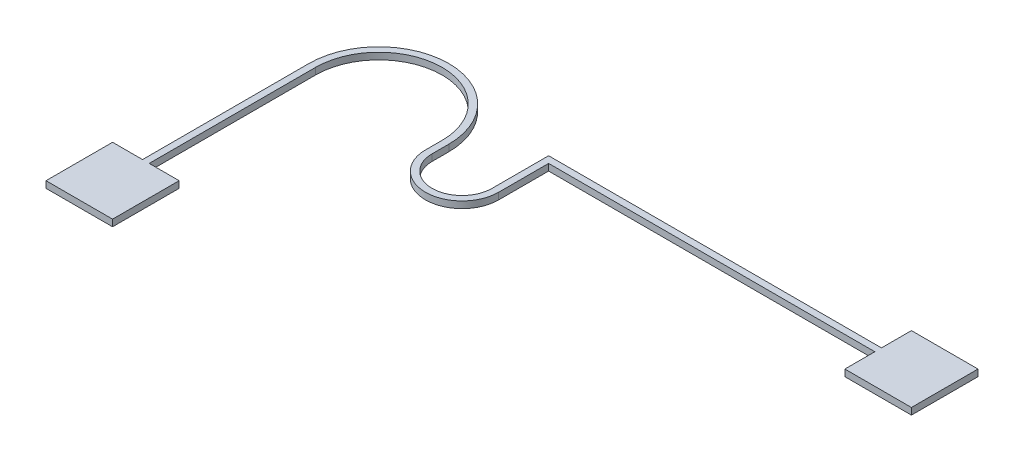
ISO-10303-21;
HEADER;
FILE_DESCRIPTION(('STEP AP214'),'2;1');
FILE_NAME('part.step','',(''),(''),'','','');
FILE_SCHEMA(('AUTOMOTIVE_DESIGN { 1 0 10303 214 1 1 1 1 }'));
ENDSEC;
DATA;
#1=APPLICATION_CONTEXT('core data for automotive mechanical design processes');
#2=APPLICATION_PROTOCOL_DEFINITION('international standard','automotive_design',2000,#1);
#3=PRODUCT_CONTEXT('',#1,'mechanical');
#4=PRODUCT('Part','Part','',(#3));
#5=PRODUCT_RELATED_PRODUCT_CATEGORY('part','',(#4));
#6=PRODUCT_DEFINITION_FORMATION('','',#4);
#7=PRODUCT_DEFINITION_CONTEXT('part definition',#1,'design');
#8=PRODUCT_DEFINITION('design','',#6,#7);
#9=PRODUCT_DEFINITION_SHAPE('','',#8);
#10=(LENGTH_UNIT() NAMED_UNIT(*) SI_UNIT(.MILLI.,.METRE.));
#11=(NAMED_UNIT(*) PLANE_ANGLE_UNIT() SI_UNIT($,.RADIAN.));
#12=(NAMED_UNIT(*) SI_UNIT($,.STERADIAN.) SOLID_ANGLE_UNIT());
#13=UNCERTAINTY_MEASURE_WITH_UNIT(LENGTH_MEASURE(1.E-05),#10,'distance_accuracy_value','');
#14=(GEOMETRIC_REPRESENTATION_CONTEXT(3) GLOBAL_UNCERTAINTY_ASSIGNED_CONTEXT((#13)) GLOBAL_UNIT_ASSIGNED_CONTEXT((#10,
#11,#12)) REPRESENTATION_CONTEXT('',''));
#15=CARTESIAN_POINT('',(0.,0.,0.));
#16=DIRECTION('',(0.,0.,1.));
#17=DIRECTION('',(1.,0.,0.));
#18=AXIS2_PLACEMENT_3D('',#15,#16,#17);
#19=CARTESIAN_POINT('',(100.,20.,0.));
#20=DIRECTION('',(1.,0.,0.));
#21=DIRECTION('',(0.,0.,-1.));
#22=AXIS2_PLACEMENT_3D('',#19,#20,#21);
#23=PLANE('',#22);
#24=DIRECTION('',(0.,0.,1.));
#25=VECTOR('',#24,1.);
#26=CARTESIAN_POINT('',(100.,0.,0.));
#27=LINE('',#26,#25);
#28=CARTESIAN_POINT('',(100.,0.,-100.));
#29=VERTEX_POINT('',#28);
#30=CARTESIAN_POINT('',(100.,0.,100.));
#31=VERTEX_POINT('',#30);
#32=EDGE_CURVE('E311',#29,#31,#27,.T.);
#33=ORIENTED_EDGE('',*,*,#32,.F.);
#34=DIRECTION('',(0.,-1.,0.));
#35=VECTOR('',#34,1.);
#36=CARTESIAN_POINT('',(100.,20.,-100.));
#37=LINE('',#36,#35);
#38=CARTESIAN_POINT('',(100.,20.,-100.));
#39=VERTEX_POINT('',#38);
#40=EDGE_CURVE('E11',#39,#29,#37,.T.);
#41=ORIENTED_EDGE('',*,*,#40,.F.);
#42=DIRECTION('',(0.,0.,1.));
#43=VECTOR('',#42,1.);
#44=CARTESIAN_POINT('',(100.,20.,0.));
#45=LINE('',#44,#43);
#46=CARTESIAN_POINT('',(100.,20.,100.));
#47=VERTEX_POINT('',#46);
#48=EDGE_CURVE('E225',#39,#47,#45,.T.);
#49=ORIENTED_EDGE('',*,*,#48,.T.);
#50=DIRECTION('',(0.,-1.,0.));
#51=VECTOR('',#50,1.);
#52=CARTESIAN_POINT('',(100.,20.,100.));
#53=LINE('',#52,#51);
#54=EDGE_CURVE('E132',#47,#31,#53,.T.);
#55=ORIENTED_EDGE('',*,*,#54,.T.);
#56=EDGE_LOOP('',(#33,#41,#49,#55));
#57=FACE_BOUND('',#56,.T.);
#58=ADVANCED_FACE('F39',(#57),#23,.T.);
#59=CARTESIAN_POINT('',(0.,20.,-100.));
#60=DIRECTION('',(0.,0.,-1.));
#61=DIRECTION('',(-1.,0.,0.));
#62=AXIS2_PLACEMENT_3D('',#59,#60,#61);
#63=PLANE('',#62);
#64=DIRECTION('',(1.,0.,0.));
#65=VECTOR('',#64,1.);
#66=CARTESIAN_POINT('',(0.,0.,-100.));
#67=LINE('',#66,#65);
#68=CARTESIAN_POINT('',(10.,0.,-100.));
#69=VERTEX_POINT('',#68);
#70=EDGE_CURVE('E307',#69,#29,#67,.T.);
#71=ORIENTED_EDGE('',*,*,#70,.F.);
#72=DIRECTION('',(0.,-1.,0.));
#73=VECTOR('',#72,1.);
#74=CARTESIAN_POINT('',(10.,20.,-100.));
#75=LINE('',#74,#73);
#76=CARTESIAN_POINT('',(10.,20.,-100.));
#77=VERTEX_POINT('',#76);
#78=EDGE_CURVE('E48',#77,#69,#75,.T.);
#79=ORIENTED_EDGE('',*,*,#78,.F.);
#80=DIRECTION('',(1.,0.,0.));
#81=VECTOR('',#80,1.);
#82=CARTESIAN_POINT('',(0.,20.,-100.));
#83=LINE('',#82,#81);
#84=EDGE_CURVE('E216',#77,#39,#83,.T.);
#85=ORIENTED_EDGE('',*,*,#84,.T.);
#86=ORIENTED_EDGE('',*,*,#40,.T.);
#87=EDGE_LOOP('',(#71,#79,#85,#86));
#88=FACE_BOUND('',#87,.T.);
#89=ADVANCED_FACE('F308',(#88),#63,.T.);
#90=CARTESIAN_POINT('',(10.,20.,0.));
#91=DIRECTION('',(1.,0.,0.));
#92=DIRECTION('',(0.,0.,-1.));
#93=AXIS2_PLACEMENT_3D('',#90,#91,#92);
#94=PLANE('',#93);
#95=DIRECTION('',(0.,0.,1.));
#96=VECTOR('',#95,1.);
#97=CARTESIAN_POINT('',(10.,0.,0.));
#98=LINE('',#97,#96);
#99=CARTESIAN_POINT('',(10.,0.,-600.));
#100=VERTEX_POINT('',#99);
#101=EDGE_CURVE('E304',#100,#69,#98,.T.);
#102=ORIENTED_EDGE('',*,*,#101,.F.);
#103=DIRECTION('',(0.,-1.,0.));
#104=VECTOR('',#103,1.);
#105=CARTESIAN_POINT('',(10.,20.,-600.));
#106=LINE('',#105,#104);
#107=CARTESIAN_POINT('',(10.,20.,-600.));
#108=VERTEX_POINT('',#107);
#109=EDGE_CURVE('E296',#108,#100,#106,.T.);
#110=ORIENTED_EDGE('',*,*,#109,.F.);
#111=DIRECTION('',(0.,0.,1.));
#112=VECTOR('',#111,1.);
#113=CARTESIAN_POINT('',(10.,20.,0.));
#114=LINE('',#113,#112);
#115=EDGE_CURVE('E224',#108,#77,#114,.T.);
#116=ORIENTED_EDGE('',*,*,#115,.T.);
#117=ORIENTED_EDGE('',*,*,#78,.T.);
#118=EDGE_LOOP('',(#102,#110,#116,#117));
#119=FACE_BOUND('',#118,.T.);
#120=ADVANCED_FACE('F302',(#119),#94,.T.);
#121=CARTESIAN_POINT('',(200.,20.,-600.));
#122=DIRECTION('',(0.,-1.,0.));
#123=DIRECTION('',(0.,0.,-1.));
#124=AXIS2_PLACEMENT_3D('',#121,#122,#123);
#125=CYLINDRICAL_SURFACE('',#124,190.);
#126=CARTESIAN_POINT('',(200.,0.,-600.));
#127=DIRECTION('',(0.,1.,0.));
#128=DIRECTION('',(0.,0.,1.));
#129=AXIS2_PLACEMENT_3D('',#126,#127,#128);
#130=CIRCLE('',#129,190.);
#131=CARTESIAN_POINT('',(390.,0.,-600.));
#132=VERTEX_POINT('',#131);
#133=EDGE_CURVE('E317',#100,#132,#130,.F.);
#134=ORIENTED_EDGE('',*,*,#133,.T.);
#135=DIRECTION('',(0.,-1.,0.));
#136=VECTOR('',#135,1.);
#137=CARTESIAN_POINT('',(390.,20.,-600.));
#138=LINE('',#137,#136);
#139=CARTESIAN_POINT('',(390.,20.,-600.));
#140=VERTEX_POINT('',#139);
#141=EDGE_CURVE('E293',#140,#132,#138,.T.);
#142=ORIENTED_EDGE('',*,*,#141,.F.);
#143=CARTESIAN_POINT('',(200.,20.,-600.));
#144=DIRECTION('',(0.,1.,0.));
#145=DIRECTION('',(0.,0.,1.));
#146=AXIS2_PLACEMENT_3D('',#143,#144,#145);
#147=CIRCLE('',#146,190.);
#148=EDGE_CURVE('E231',#108,#140,#147,.F.);
#149=ORIENTED_EDGE('',*,*,#148,.F.);
#150=ORIENTED_EDGE('',*,*,#109,.T.);
#151=EDGE_LOOP('',(#134,#142,#149,#150));
#152=FACE_BOUND('',#151,.T.);
#153=ADVANCED_FACE('F435',(#152),#125,.F.);
#154=CARTESIAN_POINT('',(390.,20.,0.));
#155=DIRECTION('',(-1.,0.,0.));
#156=DIRECTION('',(0.,0.,1.));
#157=AXIS2_PLACEMENT_3D('',#154,#155,#156);
#158=PLANE('',#157);
#159=DIRECTION('',(0.,0.,-1.));
#160=VECTOR('',#159,1.);
#161=CARTESIAN_POINT('',(390.,0.,0.));
#162=LINE('',#161,#160);
#163=CARTESIAN_POINT('',(390.,0.,-550.));
#164=VERTEX_POINT('',#163);
#165=EDGE_CURVE('E321',#164,#132,#162,.T.);
#166=ORIENTED_EDGE('',*,*,#165,.F.);
#167=DIRECTION('',(0.,-1.,0.));
#168=VECTOR('',#167,1.);
#169=CARTESIAN_POINT('',(390.,20.,-550.));
#170=LINE('',#169,#168);
#171=CARTESIAN_POINT('',(390.,20.,-550.));
#172=VERTEX_POINT('',#171);
#173=EDGE_CURVE('E290',#172,#164,#170,.T.);
#174=ORIENTED_EDGE('',*,*,#173,.F.);
#175=DIRECTION('',(0.,0.,-1.));
#176=VECTOR('',#175,1.);
#177=CARTESIAN_POINT('',(390.,20.,0.));
#178=LINE('',#177,#176);
#179=EDGE_CURVE('E426',#172,#140,#178,.T.);
#180=ORIENTED_EDGE('',*,*,#179,.T.);
#181=ORIENTED_EDGE('',*,*,#141,.T.);
#182=EDGE_LOOP('',(#166,#174,#180,#181));
#183=FACE_BOUND('',#182,.T.);
#184=ADVANCED_FACE('F438',(#183),#158,.T.);
#185=CARTESIAN_POINT('',(500.,20.,-550.));
#186=DIRECTION('',(0.,-1.,0.));
#187=DIRECTION('',(0.,0.,-1.));
#188=AXIS2_PLACEMENT_3D('',#185,#186,#187);
#189=CYLINDRICAL_SURFACE('',#188,110.);
#190=CARTESIAN_POINT('',(500.,0.,-550.));
#191=DIRECTION('',(0.,1.,0.));
#192=DIRECTION('',(0.,0.,1.));
#193=AXIS2_PLACEMENT_3D('',#190,#191,#192);
#194=CIRCLE('',#193,110.);
#195=CARTESIAN_POINT('',(610.,0.,-550.));
#196=VERTEX_POINT('',#195);
#197=EDGE_CURVE('E327',#164,#196,#194,.T.);
#198=ORIENTED_EDGE('',*,*,#197,.T.);
#199=DIRECTION('',(0.,-1.,0.));
#200=VECTOR('',#199,1.);
#201=CARTESIAN_POINT('',(610.,20.,-550.));
#202=LINE('',#201,#200);
#203=CARTESIAN_POINT('',(610.,20.,-550.));
#204=VERTEX_POINT('',#203);
#205=EDGE_CURVE('E287',#204,#196,#202,.T.);
#206=ORIENTED_EDGE('',*,*,#205,.F.);
#207=CARTESIAN_POINT('',(500.,20.,-550.));
#208=DIRECTION('',(0.,1.,0.));
#209=DIRECTION('',(0.,0.,1.));
#210=AXIS2_PLACEMENT_3D('',#207,#208,#209);
#211=CIRCLE('',#210,110.);
#212=EDGE_CURVE('E423',#172,#204,#211,.T.);
#213=ORIENTED_EDGE('',*,*,#212,.F.);
#214=ORIENTED_EDGE('',*,*,#173,.T.);
#215=EDGE_LOOP('',(#198,#206,#213,#214));
#216=FACE_BOUND('',#215,.T.);
#217=ADVANCED_FACE('F443',(#216),#189,.T.);
#218=CARTESIAN_POINT('',(610.,20.,0.));
#219=DIRECTION('',(1.,0.,0.));
#220=DIRECTION('',(0.,0.,-1.));
#221=AXIS2_PLACEMENT_3D('',#218,#219,#220);
#222=PLANE('',#221);
#223=DIRECTION('',(0.,0.,1.));
#224=VECTOR('',#223,1.);
#225=CARTESIAN_POINT('',(610.,0.,0.));
#226=LINE('',#225,#224);
#227=CARTESIAN_POINT('',(610.,0.,-700.));
#228=VERTEX_POINT('',#227);
#229=EDGE_CURVE('E331',#228,#196,#226,.T.);
#230=ORIENTED_EDGE('',*,*,#229,.F.);
#231=DIRECTION('',(0.,-1.,0.));
#232=VECTOR('',#231,1.);
#233=CARTESIAN_POINT('',(610.,20.,-700.));
#234=LINE('',#233,#232);
#235=CARTESIAN_POINT('',(610.,20.,-700.));
#236=VERTEX_POINT('',#235);
#237=EDGE_CURVE('E284',#236,#228,#234,.T.);
#238=ORIENTED_EDGE('',*,*,#237,.F.);
#239=DIRECTION('',(0.,0.,1.));
#240=VECTOR('',#239,1.);
#241=CARTESIAN_POINT('',(610.,20.,0.));
#242=LINE('',#241,#240);
#243=EDGE_CURVE('E419',#236,#204,#242,.T.);
#244=ORIENTED_EDGE('',*,*,#243,.T.);
#245=ORIENTED_EDGE('',*,*,#205,.T.);
#246=EDGE_LOOP('',(#230,#238,#244,#245));
#247=FACE_BOUND('',#246,.T.);
#248=ADVANCED_FACE('F691',(#247),#222,.T.);
#249=CARTESIAN_POINT('',(0.,20.,-700.));
#250=DIRECTION('',(0.,0.,1.));
#251=DIRECTION('',(1.,0.,0.));
#252=AXIS2_PLACEMENT_3D('',#249,#250,#251);
#253=PLANE('',#252);
#254=DIRECTION('',(-1.,0.,0.));
#255=VECTOR('',#254,1.);
#256=CARTESIAN_POINT('',(0.,0.,-700.));
#257=LINE('',#256,#255);
#258=CARTESIAN_POINT('',(1590.,0.,-700.));
#259=VERTEX_POINT('',#258);
#260=EDGE_CURVE('E335',#259,#228,#257,.T.);
#261=ORIENTED_EDGE('',*,*,#260,.F.);
#262=DIRECTION('',(0.,-1.,0.));
#263=VECTOR('',#262,1.);
#264=CARTESIAN_POINT('',(1590.,20.,-700.));
#265=LINE('',#264,#263);
#266=CARTESIAN_POINT('',(1590.,20.,-700.));
#267=VERTEX_POINT('',#266);
#268=EDGE_CURVE('E281',#267,#259,#265,.T.);
#269=ORIENTED_EDGE('',*,*,#268,.F.);
#270=DIRECTION('',(-1.,0.,0.));
#271=VECTOR('',#270,1.);
#272=CARTESIAN_POINT('',(0.,20.,-700.));
#273=LINE('',#272,#271);
#274=EDGE_CURVE('E415',#267,#236,#273,.T.);
#275=ORIENTED_EDGE('',*,*,#274,.T.);
#276=ORIENTED_EDGE('',*,*,#237,.T.);
#277=EDGE_LOOP('',(#261,#269,#275,#276));
#278=FACE_BOUND('',#277,.T.);
#279=ADVANCED_FACE('F449',(#278),#253,.T.);
#280=CARTESIAN_POINT('',(1590.,20.,0.));
#281=DIRECTION('',(1.,0.,0.));
#282=DIRECTION('',(0.,0.,-1.));
#283=AXIS2_PLACEMENT_3D('',#280,#281,#282);
#284=PLANE('',#283);
#285=DIRECTION('',(0.,0.,1.));
#286=VECTOR('',#285,1.);
#287=CARTESIAN_POINT('',(1590.,0.,0.));
#288=LINE('',#287,#286);
#289=CARTESIAN_POINT('',(1590.,0.,-610.));
#290=VERTEX_POINT('',#289);
#291=EDGE_CURVE('E339',#259,#290,#288,.T.);
#292=ORIENTED_EDGE('',*,*,#291,.T.);
#293=DIRECTION('',(0.,-1.,0.));
#294=VECTOR('',#293,1.);
#295=CARTESIAN_POINT('',(1590.,20.,-610.));
#296=LINE('',#295,#294);
#297=CARTESIAN_POINT('',(1590.,20.,-610.));
#298=VERTEX_POINT('',#297);
#299=EDGE_CURVE('E277',#298,#290,#296,.T.);
#300=ORIENTED_EDGE('',*,*,#299,.F.);
#301=DIRECTION('',(0.,0.,1.));
#302=VECTOR('',#301,1.);
#303=CARTESIAN_POINT('',(1590.,20.,0.));
#304=LINE('',#303,#302);
#305=EDGE_CURVE('E412',#267,#298,#304,.T.);
#306=ORIENTED_EDGE('',*,*,#305,.F.);
#307=ORIENTED_EDGE('',*,*,#268,.T.);
#308=EDGE_LOOP('',(#292,#300,#306,#307));
#309=FACE_BOUND('',#308,.T.);
#310=ADVANCED_FACE('F455',(#309),#284,.F.);
#311=CARTESIAN_POINT('',(0.,20.,-610.));
#312=DIRECTION('',(0.,0.,-1.));
#313=DIRECTION('',(-1.,0.,0.));
#314=AXIS2_PLACEMENT_3D('',#311,#312,#313);
#315=PLANE('',#314);
#316=DIRECTION('',(1.,0.,0.));
#317=VECTOR('',#316,1.);
#318=CARTESIAN_POINT('',(0.,0.,-610.));
#319=LINE('',#318,#317);
#320=CARTESIAN_POINT('',(1790.,0.,-610.));
#321=VERTEX_POINT('',#320);
#322=EDGE_CURVE('E342',#290,#321,#319,.T.);
#323=ORIENTED_EDGE('',*,*,#322,.T.);
#324=DIRECTION('',(0.,-1.,0.));
#325=VECTOR('',#324,1.);
#326=CARTESIAN_POINT('',(1790.,20.,-610.));
#327=LINE('',#326,#325);
#328=CARTESIAN_POINT('',(1790.,20.,-610.));
#329=VERTEX_POINT('',#328);
#330=EDGE_CURVE('E274',#329,#321,#327,.T.);
#331=ORIENTED_EDGE('',*,*,#330,.F.);
#332=DIRECTION('',(1.,0.,0.));
#333=VECTOR('',#332,1.);
#334=CARTESIAN_POINT('',(0.,20.,-610.));
#335=LINE('',#334,#333);
#336=EDGE_CURVE('E409',#298,#329,#335,.T.);
#337=ORIENTED_EDGE('',*,*,#336,.F.);
#338=ORIENTED_EDGE('',*,*,#299,.T.);
#339=EDGE_LOOP('',(#323,#331,#337,#338));
#340=FACE_BOUND('',#339,.T.);
#341=ADVANCED_FACE('F461',(#340),#315,.F.);
#342=CARTESIAN_POINT('',(1790.,20.,0.));
#343=DIRECTION('',(1.,0.,0.));
#344=DIRECTION('',(0.,0.,-1.));
#345=AXIS2_PLACEMENT_3D('',#342,#343,#344);
#346=PLANE('',#345);
#347=DIRECTION('',(0.,0.,1.));
#348=VECTOR('',#347,1.);
#349=CARTESIAN_POINT('',(1790.,0.,0.));
#350=LINE('',#349,#348);
#351=CARTESIAN_POINT('',(1790.,0.,-810.));
#352=VERTEX_POINT('',#351);
#353=EDGE_CURVE('E347',#352,#321,#350,.T.);
#354=ORIENTED_EDGE('',*,*,#353,.F.);
#355=DIRECTION('',(0.,-1.,0.));
#356=VECTOR('',#355,1.);
#357=CARTESIAN_POINT('',(1790.,20.,-810.));
#358=LINE('',#357,#356);
#359=CARTESIAN_POINT('',(1790.,20.,-810.));
#360=VERTEX_POINT('',#359);
#361=EDGE_CURVE('E271',#360,#352,#358,.T.);
#362=ORIENTED_EDGE('',*,*,#361,.F.);
#363=DIRECTION('',(0.,0.,1.));
#364=VECTOR('',#363,1.);
#365=CARTESIAN_POINT('',(1790.,20.,0.));
#366=LINE('',#365,#364);
#367=EDGE_CURVE('E405',#360,#329,#366,.T.);
#368=ORIENTED_EDGE('',*,*,#367,.T.);
#369=ORIENTED_EDGE('',*,*,#330,.T.);
#370=EDGE_LOOP('',(#354,#362,#368,#369));
#371=FACE_BOUND('',#370,.T.);
#372=ADVANCED_FACE('F465',(#371),#346,.T.);
#373=CARTESIAN_POINT('',(0.,20.,-810.));
#374=DIRECTION('',(0.,0.,-1.));
#375=DIRECTION('',(-1.,0.,0.));
#376=AXIS2_PLACEMENT_3D('',#373,#374,#375);
#377=PLANE('',#376);
#378=DIRECTION('',(1.,0.,0.));
#379=VECTOR('',#378,1.);
#380=CARTESIAN_POINT('',(0.,0.,-810.));
#381=LINE('',#380,#379);
#382=CARTESIAN_POINT('',(1590.,0.,-810.));
#383=VERTEX_POINT('',#382);
#384=EDGE_CURVE('E351',#383,#352,#381,.T.);
#385=ORIENTED_EDGE('',*,*,#384,.F.);
#386=DIRECTION('',(0.,-1.,0.));
#387=VECTOR('',#386,1.);
#388=CARTESIAN_POINT('',(1590.,20.,-810.));
#389=LINE('',#388,#387);
#390=CARTESIAN_POINT('',(1590.,20.,-810.));
#391=VERTEX_POINT('',#390);
#392=EDGE_CURVE('E268',#391,#383,#389,.T.);
#393=ORIENTED_EDGE('',*,*,#392,.F.);
#394=DIRECTION('',(1.,0.,0.));
#395=VECTOR('',#394,1.);
#396=CARTESIAN_POINT('',(0.,20.,-810.));
#397=LINE('',#396,#395);
#398=EDGE_CURVE('E401',#391,#360,#397,.T.);
#399=ORIENTED_EDGE('',*,*,#398,.T.);
#400=ORIENTED_EDGE('',*,*,#361,.T.);
#401=EDGE_LOOP('',(#385,#393,#399,#400));
#402=FACE_BOUND('',#401,.T.);
#403=ADVANCED_FACE('F468',(#402),#377,.T.);
#404=CARTESIAN_POINT('',(1590.,0.,-720.));
#405=VERTEX_POINT('',#404);
#406=EDGE_CURVE('E343',#383,#405,#288,.T.);
#407=ORIENTED_EDGE('',*,*,#406,.T.);
#408=DIRECTION('',(0.,-1.,0.));
#409=VECTOR('',#408,1.);
#410=CARTESIAN_POINT('',(1590.,20.,-720.));
#411=LINE('',#410,#409);
#412=CARTESIAN_POINT('',(1590.,20.,-720.));
#413=VERTEX_POINT('',#412);
#414=EDGE_CURVE('E264',#413,#405,#411,.T.);
#415=ORIENTED_EDGE('',*,*,#414,.F.);
#416=EDGE_CURVE('E400',#391,#413,#304,.T.);
#417=ORIENTED_EDGE('',*,*,#416,.F.);
#418=ORIENTED_EDGE('',*,*,#392,.T.);
#419=EDGE_LOOP('',(#407,#415,#417,#418));
#420=FACE_BOUND('',#419,.T.);
#421=ADVANCED_FACE('F475',(#420),#284,.F.);
#422=CARTESIAN_POINT('',(0.,20.,-720.));
#423=DIRECTION('',(0.,0.,1.));
#424=DIRECTION('',(1.,0.,0.));
#425=AXIS2_PLACEMENT_3D('',#422,#423,#424);
#426=PLANE('',#425);
#427=DIRECTION('',(-1.,0.,0.));
#428=VECTOR('',#427,1.);
#429=CARTESIAN_POINT('',(0.,0.,-720.));
#430=LINE('',#429,#428);
#431=CARTESIAN_POINT('',(590.,0.,-720.));
#432=VERTEX_POINT('',#431);
#433=EDGE_CURVE('E355',#405,#432,#430,.T.);
#434=ORIENTED_EDGE('',*,*,#433,.T.);
#435=DIRECTION('',(0.,-1.,0.));
#436=VECTOR('',#435,1.);
#437=CARTESIAN_POINT('',(590.,20.,-720.));
#438=LINE('',#437,#436);
#439=CARTESIAN_POINT('',(590.,20.,-720.));
#440=VERTEX_POINT('',#439);
#441=EDGE_CURVE('E260',#440,#432,#438,.T.);
#442=ORIENTED_EDGE('',*,*,#441,.F.);
#443=DIRECTION('',(-1.,0.,0.));
#444=VECTOR('',#443,1.);
#445=CARTESIAN_POINT('',(0.,20.,-720.));
#446=LINE('',#445,#444);
#447=EDGE_CURVE('E397',#413,#440,#446,.T.);
#448=ORIENTED_EDGE('',*,*,#447,.F.);
#449=ORIENTED_EDGE('',*,*,#414,.T.);
#450=EDGE_LOOP('',(#434,#442,#448,#449));
#451=FACE_BOUND('',#450,.T.);
#452=ADVANCED_FACE('F479',(#451),#426,.F.);
#453=CARTESIAN_POINT('',(590.,20.,0.));
#454=DIRECTION('',(1.,0.,0.));
#455=DIRECTION('',(0.,0.,-1.));
#456=AXIS2_PLACEMENT_3D('',#453,#454,#455);
#457=PLANE('',#456);
#458=DIRECTION('',(0.,0.,1.));
#459=VECTOR('',#458,1.);
#460=CARTESIAN_POINT('',(590.,0.,0.));
#461=LINE('',#460,#459);
#462=CARTESIAN_POINT('',(590.,0.,-550.));
#463=VERTEX_POINT('',#462);
#464=EDGE_CURVE('E358',#432,#463,#461,.T.);
#465=ORIENTED_EDGE('',*,*,#464,.T.);
#466=DIRECTION('',(0.,-1.,0.));
#467=VECTOR('',#466,1.);
#468=CARTESIAN_POINT('',(590.,20.,-550.));
#469=LINE('',#468,#467);
#470=CARTESIAN_POINT('',(590.,20.,-550.));
#471=VERTEX_POINT('',#470);
#472=EDGE_CURVE('E257',#471,#463,#469,.T.);
#473=ORIENTED_EDGE('',*,*,#472,.F.);
#474=DIRECTION('',(0.,0.,1.));
#475=VECTOR('',#474,1.);
#476=CARTESIAN_POINT('',(590.,20.,0.));
#477=LINE('',#476,#475);
#478=EDGE_CURVE('E394',#440,#471,#477,.T.);
#479=ORIENTED_EDGE('',*,*,#478,.F.);
#480=ORIENTED_EDGE('',*,*,#441,.T.);
#481=EDGE_LOOP('',(#465,#473,#479,#480));
#482=FACE_BOUND('',#481,.T.);
#483=ADVANCED_FACE('F484',(#482),#457,.F.);
#484=CARTESIAN_POINT('',(500.,20.,-550.));
#485=DIRECTION('',(0.,-1.,0.));
#486=DIRECTION('',(0.,0.,-1.));
#487=AXIS2_PLACEMENT_3D('',#484,#485,#486);
#488=CYLINDRICAL_SURFACE('',#487,90.);
#489=CARTESIAN_POINT('',(500.,0.,-550.));
#490=DIRECTION('',(0.,1.,0.));
#491=DIRECTION('',(0.,0.,1.));
#492=AXIS2_PLACEMENT_3D('',#489,#490,#491);
#493=CIRCLE('',#492,90.);
#494=CARTESIAN_POINT('',(410.,0.,-550.));
#495=VERTEX_POINT('',#494);
#496=EDGE_CURVE('E362',#495,#463,#493,.T.);
#497=ORIENTED_EDGE('',*,*,#496,.F.);
#498=DIRECTION('',(0.,-1.,0.));
#499=VECTOR('',#498,1.);
#500=CARTESIAN_POINT('',(410.,20.,-550.));
#501=LINE('',#500,#499);
#502=CARTESIAN_POINT('',(410.,20.,-550.));
#503=VERTEX_POINT('',#502);
#504=EDGE_CURVE('E254',#503,#495,#501,.T.);
#505=ORIENTED_EDGE('',*,*,#504,.F.);
#506=CARTESIAN_POINT('',(500.,20.,-550.));
#507=DIRECTION('',(0.,1.,0.));
#508=DIRECTION('',(0.,0.,1.));
#509=AXIS2_PLACEMENT_3D('',#506,#507,#508);
#510=CIRCLE('',#509,90.);
#511=EDGE_CURVE('E390',#503,#471,#510,.T.);
#512=ORIENTED_EDGE('',*,*,#511,.T.);
#513=ORIENTED_EDGE('',*,*,#472,.T.);
#514=EDGE_LOOP('',(#497,#505,#512,#513));
#515=FACE_BOUND('',#514,.T.);
#516=ADVANCED_FACE('F490',(#515),#488,.F.);
#517=CARTESIAN_POINT('',(410.,20.,0.));
#518=DIRECTION('',(-1.,0.,0.));
#519=DIRECTION('',(0.,0.,1.));
#520=AXIS2_PLACEMENT_3D('',#517,#518,#519);
#521=PLANE('',#520);
#522=DIRECTION('',(0.,0.,-1.));
#523=VECTOR('',#522,1.);
#524=CARTESIAN_POINT('',(410.,0.,0.));
#525=LINE('',#524,#523);
#526=CARTESIAN_POINT('',(410.,0.,-600.));
#527=VERTEX_POINT('',#526);
#528=EDGE_CURVE('E366',#495,#527,#525,.T.);
#529=ORIENTED_EDGE('',*,*,#528,.T.);
#530=DIRECTION('',(0.,-1.,0.));
#531=VECTOR('',#530,1.);
#532=CARTESIAN_POINT('',(410.,20.,-600.));
#533=LINE('',#532,#531);
#534=CARTESIAN_POINT('',(410.,20.,-600.));
#535=VERTEX_POINT('',#534);
#536=EDGE_CURVE('E251',#535,#527,#533,.T.);
#537=ORIENTED_EDGE('',*,*,#536,.F.);
#538=DIRECTION('',(0.,0.,-1.));
#539=VECTOR('',#538,1.);
#540=CARTESIAN_POINT('',(410.,20.,0.));
#541=LINE('',#540,#539);
#542=EDGE_CURVE('E387',#503,#535,#541,.T.);
#543=ORIENTED_EDGE('',*,*,#542,.F.);
#544=ORIENTED_EDGE('',*,*,#504,.T.);
#545=EDGE_LOOP('',(#529,#537,#543,#544));
#546=FACE_BOUND('',#545,.T.);
#547=ADVANCED_FACE('F493',(#546),#521,.F.);
#548=CARTESIAN_POINT('',(200.,20.,-600.));
#549=DIRECTION('',(0.,-1.,0.));
#550=DIRECTION('',(0.,0.,-1.));
#551=AXIS2_PLACEMENT_3D('',#548,#549,#550);
#552=CYLINDRICAL_SURFACE('',#551,210.);
#553=CARTESIAN_POINT('',(200.,0.,-600.));
#554=DIRECTION('',(0.,1.,0.));
#555=DIRECTION('',(0.,0.,1.));
#556=AXIS2_PLACEMENT_3D('',#553,#554,#555);
#557=CIRCLE('',#556,210.);
#558=CARTESIAN_POINT('',(-10.,0.,-600.));
#559=VERTEX_POINT('',#558);
#560=EDGE_CURVE('E370',#559,#527,#557,.F.);
#561=ORIENTED_EDGE('',*,*,#560,.F.);
#562=DIRECTION('',(0.,-1.,0.));
#563=VECTOR('',#562,1.);
#564=CARTESIAN_POINT('',(-10.,20.,-600.));
#565=LINE('',#564,#563);
#566=CARTESIAN_POINT('',(-10.,20.,-600.));
#567=VERTEX_POINT('',#566);
#568=EDGE_CURVE('E248',#567,#559,#565,.T.);
#569=ORIENTED_EDGE('',*,*,#568,.F.);
#570=CARTESIAN_POINT('',(200.,20.,-600.));
#571=DIRECTION('',(0.,1.,0.));
#572=DIRECTION('',(0.,0.,1.));
#573=AXIS2_PLACEMENT_3D('',#570,#571,#572);
#574=CIRCLE('',#573,210.);
#575=EDGE_CURVE('E218',#567,#535,#574,.F.);
#576=ORIENTED_EDGE('',*,*,#575,.T.);
#577=ORIENTED_EDGE('',*,*,#536,.T.);
#578=EDGE_LOOP('',(#561,#569,#576,#577));
#579=FACE_BOUND('',#578,.T.);
#580=ADVANCED_FACE('F495',(#579),#552,.T.);
#581=CARTESIAN_POINT('',(-10.,20.,0.));
#582=DIRECTION('',(1.,0.,0.));
#583=DIRECTION('',(0.,0.,-1.));
#584=AXIS2_PLACEMENT_3D('',#581,#582,#583);
#585=PLANE('',#584);
#586=DIRECTION('',(0.,0.,1.));
#587=VECTOR('',#586,1.);
#588=CARTESIAN_POINT('',(-10.,0.,0.));
#589=LINE('',#588,#587);
#590=CARTESIAN_POINT('',(-10.,0.,-100.));
#591=VERTEX_POINT('',#590);
#592=EDGE_CURVE('E373',#559,#591,#589,.T.);
#593=ORIENTED_EDGE('',*,*,#592,.T.);
#594=DIRECTION('',(0.,-1.,0.));
#595=VECTOR('',#594,1.);
#596=CARTESIAN_POINT('',(-10.,20.,-100.));
#597=LINE('',#596,#595);
#598=CARTESIAN_POINT('',(-10.,20.,-100.));
#599=VERTEX_POINT('',#598);
#600=EDGE_CURVE('E202',#599,#591,#597,.T.);
#601=ORIENTED_EDGE('',*,*,#600,.F.);
#602=DIRECTION('',(0.,0.,1.));
#603=VECTOR('',#602,1.);
#604=CARTESIAN_POINT('',(-10.,20.,0.));
#605=LINE('',#604,#603);
#606=EDGE_CURVE('E212',#567,#599,#605,.T.);
#607=ORIENTED_EDGE('',*,*,#606,.F.);
#608=ORIENTED_EDGE('',*,*,#568,.T.);
#609=EDGE_LOOP('',(#593,#601,#607,#608));
#610=FACE_BOUND('',#609,.T.);
#611=ADVANCED_FACE('F496',(#610),#585,.F.);
#612=CARTESIAN_POINT('',(-100.,0.,-100.));
#613=VERTEX_POINT('',#612);
#614=EDGE_CURVE('E200',#613,#591,#67,.T.);
#615=ORIENTED_EDGE('',*,*,#614,.F.);
#616=DIRECTION('',(0.,-1.,0.));
#617=VECTOR('',#616,1.);
#618=CARTESIAN_POINT('',(-100.,20.,-100.));
#619=LINE('',#618,#617);
#620=CARTESIAN_POINT('',(-100.,20.,-100.));
#621=VERTEX_POINT('',#620);
#622=EDGE_CURVE('E194',#621,#613,#619,.T.);
#623=ORIENTED_EDGE('',*,*,#622,.F.);
#624=EDGE_CURVE('E198',#621,#599,#83,.T.);
#625=ORIENTED_EDGE('',*,*,#624,.T.);
#626=ORIENTED_EDGE('',*,*,#600,.T.);
#627=EDGE_LOOP('',(#615,#623,#625,#626));
#628=FACE_BOUND('',#627,.T.);
#629=ADVANCED_FACE('F196',(#628),#63,.T.);
#630=CARTESIAN_POINT('',(-100.,20.,0.));
#631=DIRECTION('',(1.,0.,0.));
#632=DIRECTION('',(0.,0.,-1.));
#633=AXIS2_PLACEMENT_3D('',#630,#631,#632);
#634=PLANE('',#633);
#635=DIRECTION('',(0.,0.,1.));
#636=VECTOR('',#635,1.);
#637=CARTESIAN_POINT('',(-100.,0.,0.));
#638=LINE('',#637,#636);
#639=CARTESIAN_POINT('',(-100.,0.,100.));
#640=VERTEX_POINT('',#639);
#641=EDGE_CURVE('E125',#613,#640,#638,.T.);
#642=ORIENTED_EDGE('',*,*,#641,.T.);
#643=DIRECTION('',(0.,-1.,0.));
#644=VECTOR('',#643,1.);
#645=CARTESIAN_POINT('',(-100.,20.,100.));
#646=LINE('',#645,#644);
#647=CARTESIAN_POINT('',(-100.,20.,100.));
#648=VERTEX_POINT('',#647);
#649=EDGE_CURVE('E203',#648,#640,#646,.T.);
#650=ORIENTED_EDGE('',*,*,#649,.F.);
#651=DIRECTION('',(0.,0.,1.));
#652=VECTOR('',#651,1.);
#653=CARTESIAN_POINT('',(-100.,20.,0.));
#654=LINE('',#653,#652);
#655=EDGE_CURVE('E205',#621,#648,#654,.T.);
#656=ORIENTED_EDGE('',*,*,#655,.F.);
#657=ORIENTED_EDGE('',*,*,#622,.T.);
#658=EDGE_LOOP('',(#642,#650,#656,#657));
#659=FACE_BOUND('',#658,.T.);
#660=ADVANCED_FACE('F206',(#659),#634,.F.);
#661=CARTESIAN_POINT('',(0.,20.,100.));
#662=DIRECTION('',(0.,0.,-1.));
#663=DIRECTION('',(-1.,0.,0.));
#664=AXIS2_PLACEMENT_3D('',#661,#662,#663);
#665=PLANE('',#664);
#666=DIRECTION('',(1.,0.,0.));
#667=VECTOR('',#666,1.);
#668=CARTESIAN_POINT('',(0.,0.,100.));
#669=LINE('',#668,#667);
#670=EDGE_CURVE('E232',#640,#31,#669,.T.);
#671=ORIENTED_EDGE('',*,*,#670,.T.);
#672=ORIENTED_EDGE('',*,*,#54,.F.);
#673=DIRECTION('',(1.,0.,0.));
#674=VECTOR('',#673,1.);
#675=CARTESIAN_POINT('',(0.,20.,100.));
#676=LINE('',#675,#674);
#677=EDGE_CURVE('E56',#648,#47,#676,.T.);
#678=ORIENTED_EDGE('',*,*,#677,.F.);
#679=ORIENTED_EDGE('',*,*,#649,.T.);
#680=EDGE_LOOP('',(#671,#672,#678,#679));
#681=FACE_BOUND('',#680,.T.);
#682=ADVANCED_FACE('F515',(#681),#665,.F.);
#683=CARTESIAN_POINT('',(0.,20.,0.));
#684=DIRECTION('',(0.,1.,0.));
#685=DIRECTION('',(0.,0.,1.));
#686=AXIS2_PLACEMENT_3D('',#683,#684,#685);
#687=PLANE('',#686);
#688=ORIENTED_EDGE('',*,*,#48,.F.);
#689=ORIENTED_EDGE('',*,*,#84,.F.);
#690=ORIENTED_EDGE('',*,*,#115,.F.);
#691=ORIENTED_EDGE('',*,*,#148,.T.);
#692=ORIENTED_EDGE('',*,*,#179,.F.);
#693=ORIENTED_EDGE('',*,*,#212,.T.);
#694=ORIENTED_EDGE('',*,*,#243,.F.);
#695=ORIENTED_EDGE('',*,*,#274,.F.);
#696=ORIENTED_EDGE('',*,*,#305,.T.);
#697=ORIENTED_EDGE('',*,*,#336,.T.);
#698=ORIENTED_EDGE('',*,*,#367,.F.);
#699=ORIENTED_EDGE('',*,*,#398,.F.);
#700=ORIENTED_EDGE('',*,*,#416,.T.);
#701=ORIENTED_EDGE('',*,*,#447,.T.);
#702=ORIENTED_EDGE('',*,*,#478,.T.);
#703=ORIENTED_EDGE('',*,*,#511,.F.);
#704=ORIENTED_EDGE('',*,*,#542,.T.);
#705=ORIENTED_EDGE('',*,*,#575,.F.);
#706=ORIENTED_EDGE('',*,*,#606,.T.);
#707=ORIENTED_EDGE('',*,*,#624,.F.);
#708=ORIENTED_EDGE('',*,*,#655,.T.);
#709=ORIENTED_EDGE('',*,*,#677,.T.);
#710=EDGE_LOOP('',(#688,#689,#690,#691,#692,#693,#694,#695,#696,#697,#698,#699,#700,#701,#702,
#703,#704,#705,#706,#707,#708,#709));
#711=FACE_BOUND('',#710,.T.);
#712=ADVANCED_FACE('F209',(#711),#687,.T.);
#713=CARTESIAN_POINT('',(0.,0.,0.));
#714=DIRECTION('',(0.,1.,0.));
#715=DIRECTION('',(0.,0.,1.));
#716=AXIS2_PLACEMENT_3D('',#713,#714,#715);
#717=PLANE('',#716);
#718=ORIENTED_EDGE('',*,*,#32,.T.);
#719=ORIENTED_EDGE('',*,*,#670,.F.);
#720=ORIENTED_EDGE('',*,*,#641,.F.);
#721=ORIENTED_EDGE('',*,*,#614,.T.);
#722=ORIENTED_EDGE('',*,*,#592,.F.);
#723=ORIENTED_EDGE('',*,*,#560,.T.);
#724=ORIENTED_EDGE('',*,*,#528,.F.);
#725=ORIENTED_EDGE('',*,*,#496,.T.);
#726=ORIENTED_EDGE('',*,*,#464,.F.);
#727=ORIENTED_EDGE('',*,*,#433,.F.);
#728=ORIENTED_EDGE('',*,*,#406,.F.);
#729=ORIENTED_EDGE('',*,*,#384,.T.);
#730=ORIENTED_EDGE('',*,*,#353,.T.);
#731=ORIENTED_EDGE('',*,*,#322,.F.);
#732=ORIENTED_EDGE('',*,*,#291,.F.);
#733=ORIENTED_EDGE('',*,*,#260,.T.);
#734=ORIENTED_EDGE('',*,*,#229,.T.);
#735=ORIENTED_EDGE('',*,*,#197,.F.);
#736=ORIENTED_EDGE('',*,*,#165,.T.);
#737=ORIENTED_EDGE('',*,*,#133,.F.);
#738=ORIENTED_EDGE('',*,*,#101,.T.);
#739=ORIENTED_EDGE('',*,*,#70,.T.);
#740=EDGE_LOOP('',(#718,#719,#720,#721,#722,#723,#724,#725,#726,#727,#728,#729,#730,#731,#732,
#733,#734,#735,#736,#737,#738,#739));
#741=FACE_BOUND('',#740,.T.);
#742=ADVANCED_FACE('F314',(#741),#717,.F.);
#743=CLOSED_SHELL('',(#58,#89,#120,#153,#184,#217,#248,#279,#310,#341,#372,#403,#421,#452,#483,
#516,#547,#580,#611,#629,#660,#682,#712,#742));
#744=MANIFOLD_SOLID_BREP('B2',#743);
#745=ADVANCED_BREP_SHAPE_REPRESENTATION('',(#18,#744),#14);
#746=SHAPE_DEFINITION_REPRESENTATION(#9,#745);
ENDSEC;
END-ISO-10303-21;
